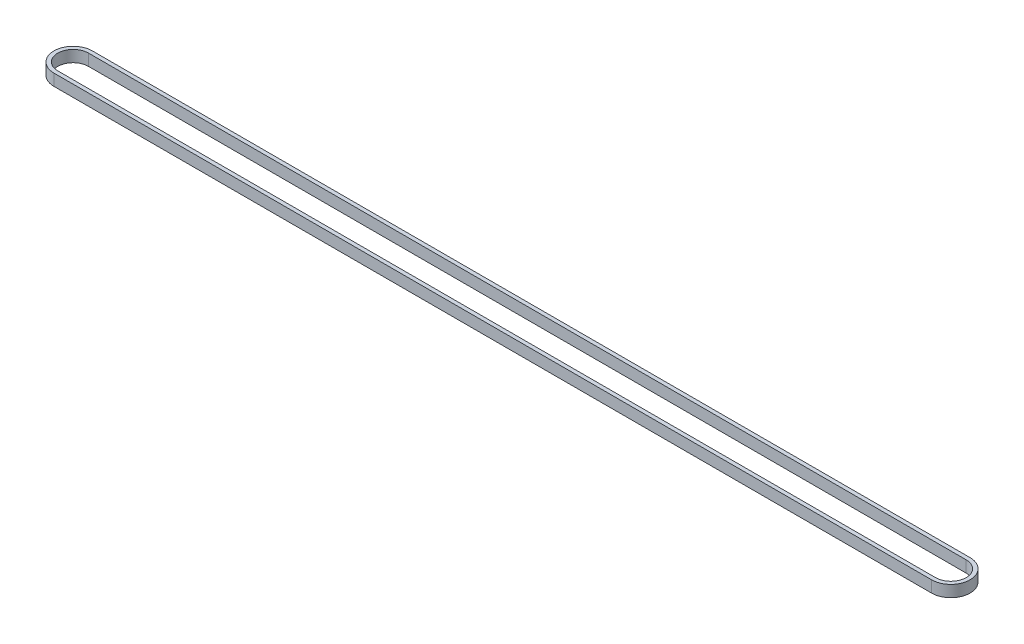
ISO-10303-21;
HEADER;
FILE_DESCRIPTION(('STEP AP214'),'2;1');
FILE_NAME('part.step','',(''),(''),'','','');
FILE_SCHEMA(('AUTOMOTIVE_DESIGN { 1 0 10303 214 1 1 1 1 }'));
ENDSEC;
DATA;
#1=APPLICATION_CONTEXT('core data for automotive mechanical design processes');
#2=APPLICATION_PROTOCOL_DEFINITION('international standard','automotive_design',2000,#1);
#3=PRODUCT_CONTEXT('',#1,'mechanical');
#4=PRODUCT('Part','Part','',(#3));
#5=PRODUCT_RELATED_PRODUCT_CATEGORY('part','',(#4));
#6=PRODUCT_DEFINITION_FORMATION('','',#4);
#7=PRODUCT_DEFINITION_CONTEXT('part definition',#1,'design');
#8=PRODUCT_DEFINITION('design','',#6,#7);
#9=PRODUCT_DEFINITION_SHAPE('','',#8);
#10=(LENGTH_UNIT() NAMED_UNIT(*) SI_UNIT(.MILLI.,.METRE.));
#11=(NAMED_UNIT(*) PLANE_ANGLE_UNIT() SI_UNIT($,.RADIAN.));
#12=(NAMED_UNIT(*) SI_UNIT($,.STERADIAN.) SOLID_ANGLE_UNIT());
#13=UNCERTAINTY_MEASURE_WITH_UNIT(LENGTH_MEASURE(1.E-05),#10,'distance_accuracy_value','');
#14=(GEOMETRIC_REPRESENTATION_CONTEXT(3) GLOBAL_UNCERTAINTY_ASSIGNED_CONTEXT((#13)) GLOBAL_UNIT_ASSIGNED_CONTEXT((#10,
#11,#12)) REPRESENTATION_CONTEXT('',''));
#15=CARTESIAN_POINT('',(0.,0.,0.));
#16=DIRECTION('',(0.,0.,1.));
#17=DIRECTION('',(1.,0.,0.));
#18=AXIS2_PLACEMENT_3D('',#15,#16,#17);
#19=CARTESIAN_POINT('',(8.,6.,0.));
#20=DIRECTION('',(0.,-1.,0.));
#21=DIRECTION('',(0.,0.,-1.));
#22=AXIS2_PLACEMENT_3D('',#19,#20,#21);
#23=PLANE('',#22);
#24=CARTESIAN_POINT('',(-456.5,6.,0.));
#25=DIRECTION('',(0.,1.,0.));
#26=DIRECTION('',(0.,0.,-1.));
#27=AXIS2_PLACEMENT_3D('',#24,#25,#26);
#28=CIRCLE('',#27,8.);
#29=CARTESIAN_POINT('',(-456.5,6.,-8.));
#30=VERTEX_POINT('',#29);
#31=CARTESIAN_POINT('',(-456.5,6.,8.));
#32=VERTEX_POINT('',#31);
#33=EDGE_CURVE('E11',#30,#32,#28,.T.);
#34=ORIENTED_EDGE('',*,*,#33,.F.);
#35=DIRECTION('',(-1.,0.,0.));
#36=VECTOR('',#35,1.);
#37=CARTESIAN_POINT('',(0.,6.,-8.));
#38=LINE('',#37,#36);
#39=CARTESIAN_POINT('',(0.,6.,-8.));
#40=VERTEX_POINT('',#39);
#41=EDGE_CURVE('E181',#40,#30,#38,.T.);
#42=ORIENTED_EDGE('',*,*,#41,.F.);
#43=CARTESIAN_POINT('',(0.,6.,0.));
#44=DIRECTION('',(0.,1.,0.));
#45=DIRECTION('',(0.,0.,1.));
#46=AXIS2_PLACEMENT_3D('',#43,#44,#45);
#47=CIRCLE('',#46,8.);
#48=CARTESIAN_POINT('',(0.,6.,8.));
#49=VERTEX_POINT('',#48);
#50=EDGE_CURVE('E137',#49,#40,#47,.T.);
#51=ORIENTED_EDGE('',*,*,#50,.F.);
#52=DIRECTION('',(1.,0.,0.));
#53=VECTOR('',#52,1.);
#54=CARTESIAN_POINT('',(-456.5,6.,8.));
#55=LINE('',#54,#53);
#56=EDGE_CURVE('E139',#32,#49,#55,.T.);
#57=ORIENTED_EDGE('',*,*,#56,.F.);
#58=EDGE_LOOP('',(#34,#42,#51,#57));
#59=FACE_BOUND('',#58,.T.);
#60=DIRECTION('',(1.,0.,0.));
#61=VECTOR('',#60,1.);
#62=CARTESIAN_POINT('',(-456.5,6.,10.));
#63=LINE('',#62,#61);
#64=CARTESIAN_POINT('',(-456.5,6.,10.));
#65=VERTEX_POINT('',#64);
#66=CARTESIAN_POINT('',(0.,6.,10.));
#67=VERTEX_POINT('',#66);
#68=EDGE_CURVE('E63',#65,#67,#63,.T.);
#69=ORIENTED_EDGE('',*,*,#68,.T.);
#70=CARTESIAN_POINT('',(0.,6.,0.));
#71=DIRECTION('',(0.,1.,0.));
#72=DIRECTION('',(0.,0.,1.));
#73=AXIS2_PLACEMENT_3D('',#70,#71,#72);
#74=CIRCLE('',#73,10.);
#75=CARTESIAN_POINT('',(0.,6.,-10.));
#76=VERTEX_POINT('',#75);
#77=EDGE_CURVE('E115',#67,#76,#74,.T.);
#78=ORIENTED_EDGE('',*,*,#77,.T.);
#79=DIRECTION('',(-1.,0.,0.));
#80=VECTOR('',#79,1.);
#81=CARTESIAN_POINT('',(0.,6.,-10.));
#82=LINE('',#81,#80);
#83=CARTESIAN_POINT('',(-456.5,6.,-10.));
#84=VERTEX_POINT('',#83);
#85=EDGE_CURVE('E79',#76,#84,#82,.T.);
#86=ORIENTED_EDGE('',*,*,#85,.T.);
#87=CARTESIAN_POINT('',(-456.5,6.,0.));
#88=DIRECTION('',(0.,1.,0.));
#89=DIRECTION('',(0.,0.,-1.));
#90=AXIS2_PLACEMENT_3D('',#87,#88,#89);
#91=CIRCLE('',#90,10.);
#92=EDGE_CURVE('E195',#84,#65,#91,.T.);
#93=ORIENTED_EDGE('',*,*,#92,.T.);
#94=EDGE_LOOP('',(#69,#78,#86,#93));
#95=FACE_BOUND('',#94,.T.);
#96=ADVANCED_FACE('F16',(#59,#95),#23,.F.);
#97=CARTESIAN_POINT('',(8.,0.,0.));
#98=DIRECTION('',(0.,1.,0.));
#99=DIRECTION('',(1.,0.,0.));
#100=AXIS2_PLACEMENT_3D('',#97,#98,#99);
#101=PLANE('',#100);
#102=DIRECTION('',(1.,0.,0.));
#103=VECTOR('',#102,1.);
#104=CARTESIAN_POINT('',(-456.5,0.,8.));
#105=LINE('',#104,#103);
#106=CARTESIAN_POINT('',(-456.5,0.,8.));
#107=VERTEX_POINT('',#106);
#108=CARTESIAN_POINT('',(0.,0.,8.));
#109=VERTEX_POINT('',#108);
#110=EDGE_CURVE('E160',#107,#109,#105,.T.);
#111=ORIENTED_EDGE('',*,*,#110,.T.);
#112=CARTESIAN_POINT('',(0.,0.,0.));
#113=DIRECTION('',(0.,1.,0.));
#114=DIRECTION('',(0.,0.,1.));
#115=AXIS2_PLACEMENT_3D('',#112,#113,#114);
#116=CIRCLE('',#115,8.);
#117=CARTESIAN_POINT('',(0.,0.,-8.));
#118=VERTEX_POINT('',#117);
#119=EDGE_CURVE('E138',#109,#118,#116,.T.);
#120=ORIENTED_EDGE('',*,*,#119,.T.);
#121=DIRECTION('',(-1.,0.,0.));
#122=VECTOR('',#121,1.);
#123=CARTESIAN_POINT('',(0.,0.,-8.));
#124=LINE('',#123,#122);
#125=CARTESIAN_POINT('',(-456.5,0.,-8.));
#126=VERTEX_POINT('',#125);
#127=EDGE_CURVE('E131',#118,#126,#124,.T.);
#128=ORIENTED_EDGE('',*,*,#127,.T.);
#129=CARTESIAN_POINT('',(-456.5,0.,0.));
#130=DIRECTION('',(0.,1.,0.));
#131=DIRECTION('',(0.,0.,-1.));
#132=AXIS2_PLACEMENT_3D('',#129,#130,#131);
#133=CIRCLE('',#132,8.);
#134=EDGE_CURVE('E27',#126,#107,#133,.T.);
#135=ORIENTED_EDGE('',*,*,#134,.T.);
#136=EDGE_LOOP('',(#111,#120,#128,#135));
#137=FACE_BOUND('',#136,.T.);
#138=CARTESIAN_POINT('',(-456.5,0.,0.));
#139=DIRECTION('',(0.,1.,0.));
#140=DIRECTION('',(0.,0.,-1.));
#141=AXIS2_PLACEMENT_3D('',#138,#139,#140);
#142=CIRCLE('',#141,10.);
#143=CARTESIAN_POINT('',(-456.5,0.,-10.));
#144=VERTEX_POINT('',#143);
#145=CARTESIAN_POINT('',(-456.5,0.,10.));
#146=VERTEX_POINT('',#145);
#147=EDGE_CURVE('E197',#144,#146,#142,.T.);
#148=ORIENTED_EDGE('',*,*,#147,.F.);
#149=DIRECTION('',(-1.,0.,0.));
#150=VECTOR('',#149,1.);
#151=CARTESIAN_POINT('',(0.,0.,-10.));
#152=LINE('',#151,#150);
#153=CARTESIAN_POINT('',(0.,0.,-10.));
#154=VERTEX_POINT('',#153);
#155=EDGE_CURVE('E117',#154,#144,#152,.T.);
#156=ORIENTED_EDGE('',*,*,#155,.F.);
#157=CARTESIAN_POINT('',(0.,0.,0.));
#158=DIRECTION('',(0.,1.,0.));
#159=DIRECTION('',(0.,0.,1.));
#160=AXIS2_PLACEMENT_3D('',#157,#158,#159);
#161=CIRCLE('',#160,10.);
#162=CARTESIAN_POINT('',(0.,0.,10.));
#163=VERTEX_POINT('',#162);
#164=EDGE_CURVE('E114',#163,#154,#161,.T.);
#165=ORIENTED_EDGE('',*,*,#164,.F.);
#166=DIRECTION('',(1.,0.,0.));
#167=VECTOR('',#166,1.);
#168=CARTESIAN_POINT('',(-456.5,0.,10.));
#169=LINE('',#168,#167);
#170=EDGE_CURVE('E20',#146,#163,#169,.T.);
#171=ORIENTED_EDGE('',*,*,#170,.F.);
#172=EDGE_LOOP('',(#148,#156,#165,#171));
#173=FACE_BOUND('',#172,.T.);
#174=ADVANCED_FACE('F119',(#137,#173),#101,.F.);
#175=CARTESIAN_POINT('',(-456.5,0.,0.));
#176=DIRECTION('',(0.,1.,0.));
#177=DIRECTION('',(0.,0.,-1.));
#178=AXIS2_PLACEMENT_3D('',#175,#176,#177);
#179=CYLINDRICAL_SURFACE('',#178,8.);
#180=ORIENTED_EDGE('',*,*,#134,.F.);
#181=DIRECTION('',(0.,1.,0.));
#182=VECTOR('',#181,1.);
#183=CARTESIAN_POINT('',(-456.5,0.,-8.));
#184=LINE('',#183,#182);
#185=EDGE_CURVE('E163',#126,#30,#184,.T.);
#186=ORIENTED_EDGE('',*,*,#185,.T.);
#187=ORIENTED_EDGE('',*,*,#33,.T.);
#188=DIRECTION('',(0.,1.,0.));
#189=VECTOR('',#188,1.);
#190=CARTESIAN_POINT('',(-456.5,0.,8.));
#191=LINE('',#190,#189);
#192=EDGE_CURVE('E143',#107,#32,#191,.T.);
#193=ORIENTED_EDGE('',*,*,#192,.F.);
#194=EDGE_LOOP('',(#180,#186,#187,#193));
#195=FACE_BOUND('',#194,.T.);
#196=ADVANCED_FACE('F172',(#195),#179,.F.);
#197=CARTESIAN_POINT('',(-456.5,0.,8.));
#198=DIRECTION('',(0.,0.,1.));
#199=DIRECTION('',(1.,0.,0.));
#200=AXIS2_PLACEMENT_3D('',#197,#198,#199);
#201=PLANE('',#200);
#202=ORIENTED_EDGE('',*,*,#110,.F.);
#203=ORIENTED_EDGE('',*,*,#192,.T.);
#204=ORIENTED_EDGE('',*,*,#56,.T.);
#205=DIRECTION('',(0.,1.,0.));
#206=VECTOR('',#205,1.);
#207=CARTESIAN_POINT('',(0.,0.,8.));
#208=LINE('',#207,#206);
#209=EDGE_CURVE('E133',#109,#49,#208,.T.);
#210=ORIENTED_EDGE('',*,*,#209,.F.);
#211=EDGE_LOOP('',(#202,#203,#204,#210));
#212=FACE_BOUND('',#211,.T.);
#213=ADVANCED_FACE('F18',(#212),#201,.F.);
#214=CARTESIAN_POINT('',(0.,0.,-8.));
#215=DIRECTION('',(0.,0.,-1.));
#216=DIRECTION('',(-1.,0.,0.));
#217=AXIS2_PLACEMENT_3D('',#214,#215,#216);
#218=PLANE('',#217);
#219=ORIENTED_EDGE('',*,*,#127,.F.);
#220=DIRECTION('',(0.,1.,0.));
#221=VECTOR('',#220,1.);
#222=CARTESIAN_POINT('',(0.,0.,-8.));
#223=LINE('',#222,#221);
#224=EDGE_CURVE('E146',#118,#40,#223,.T.);
#225=ORIENTED_EDGE('',*,*,#224,.T.);
#226=ORIENTED_EDGE('',*,*,#41,.T.);
#227=ORIENTED_EDGE('',*,*,#185,.F.);
#228=EDGE_LOOP('',(#219,#225,#226,#227));
#229=FACE_BOUND('',#228,.T.);
#230=ADVANCED_FACE('F178',(#229),#218,.F.);
#231=CARTESIAN_POINT('',(0.,0.,0.));
#232=DIRECTION('',(0.,1.,0.));
#233=DIRECTION('',(0.,0.,1.));
#234=AXIS2_PLACEMENT_3D('',#231,#232,#233);
#235=CYLINDRICAL_SURFACE('',#234,8.);
#236=ORIENTED_EDGE('',*,*,#119,.F.);
#237=ORIENTED_EDGE('',*,*,#209,.T.);
#238=ORIENTED_EDGE('',*,*,#50,.T.);
#239=ORIENTED_EDGE('',*,*,#224,.F.);
#240=EDGE_LOOP('',(#236,#237,#238,#239));
#241=FACE_BOUND('',#240,.T.);
#242=ADVANCED_FACE('F313',(#241),#235,.F.);
#243=CARTESIAN_POINT('',(-456.5,0.,0.));
#244=DIRECTION('',(0.,1.,0.));
#245=DIRECTION('',(0.,0.,-1.));
#246=AXIS2_PLACEMENT_3D('',#243,#244,#245);
#247=CYLINDRICAL_SURFACE('',#246,10.);
#248=ORIENTED_EDGE('',*,*,#147,.T.);
#249=DIRECTION('',(0.,1.,0.));
#250=VECTOR('',#249,1.);
#251=CARTESIAN_POINT('',(-456.5,0.,10.));
#252=LINE('',#251,#250);
#253=EDGE_CURVE('E106',#146,#65,#252,.T.);
#254=ORIENTED_EDGE('',*,*,#253,.T.);
#255=ORIENTED_EDGE('',*,*,#92,.F.);
#256=DIRECTION('',(0.,1.,0.));
#257=VECTOR('',#256,1.);
#258=CARTESIAN_POINT('',(-456.5,0.,-10.));
#259=LINE('',#258,#257);
#260=EDGE_CURVE('E152',#144,#84,#259,.T.);
#261=ORIENTED_EDGE('',*,*,#260,.F.);
#262=EDGE_LOOP('',(#248,#254,#255,#261));
#263=FACE_BOUND('',#262,.T.);
#264=ADVANCED_FACE('F303',(#263),#247,.T.);
#265=CARTESIAN_POINT('',(-456.5,0.,10.));
#266=DIRECTION('',(0.,0.,1.));
#267=DIRECTION('',(1.,0.,0.));
#268=AXIS2_PLACEMENT_3D('',#265,#266,#267);
#269=PLANE('',#268);
#270=ORIENTED_EDGE('',*,*,#170,.T.);
#271=DIRECTION('',(0.,1.,0.));
#272=VECTOR('',#271,1.);
#273=CARTESIAN_POINT('',(0.,0.,10.));
#274=LINE('',#273,#272);
#275=EDGE_CURVE('E103',#163,#67,#274,.T.);
#276=ORIENTED_EDGE('',*,*,#275,.T.);
#277=ORIENTED_EDGE('',*,*,#68,.F.);
#278=ORIENTED_EDGE('',*,*,#253,.F.);
#279=EDGE_LOOP('',(#270,#276,#277,#278));
#280=FACE_BOUND('',#279,.T.);
#281=ADVANCED_FACE('F102',(#280),#269,.T.);
#282=CARTESIAN_POINT('',(0.,0.,-10.));
#283=DIRECTION('',(0.,0.,-1.));
#284=DIRECTION('',(-1.,0.,0.));
#285=AXIS2_PLACEMENT_3D('',#282,#283,#284);
#286=PLANE('',#285);
#287=ORIENTED_EDGE('',*,*,#155,.T.);
#288=ORIENTED_EDGE('',*,*,#260,.T.);
#289=ORIENTED_EDGE('',*,*,#85,.F.);
#290=DIRECTION('',(0.,1.,0.));
#291=VECTOR('',#290,1.);
#292=CARTESIAN_POINT('',(0.,0.,-10.));
#293=LINE('',#292,#291);
#294=EDGE_CURVE('E122',#154,#76,#293,.T.);
#295=ORIENTED_EDGE('',*,*,#294,.F.);
#296=EDGE_LOOP('',(#287,#288,#289,#295));
#297=FACE_BOUND('',#296,.T.);
#298=ADVANCED_FACE('F280',(#297),#286,.T.);
#299=CARTESIAN_POINT('',(0.,0.,0.));
#300=DIRECTION('',(0.,1.,0.));
#301=DIRECTION('',(0.,0.,1.));
#302=AXIS2_PLACEMENT_3D('',#299,#300,#301);
#303=CYLINDRICAL_SURFACE('',#302,10.);
#304=ORIENTED_EDGE('',*,*,#164,.T.);
#305=ORIENTED_EDGE('',*,*,#294,.T.);
#306=ORIENTED_EDGE('',*,*,#77,.F.);
#307=ORIENTED_EDGE('',*,*,#275,.F.);
#308=EDGE_LOOP('',(#304,#305,#306,#307));
#309=FACE_BOUND('',#308,.T.);
#310=ADVANCED_FACE('F112',(#309),#303,.T.);
#311=CLOSED_SHELL('',(#96,#174,#196,#213,#230,#242,#264,#281,#298,#310));
#312=MANIFOLD_SOLID_BREP('B1',#311);
#313=ADVANCED_BREP_SHAPE_REPRESENTATION('',(#18,#312),#14);
#314=SHAPE_DEFINITION_REPRESENTATION(#9,#313);
ENDSEC;
END-ISO-10303-21;
